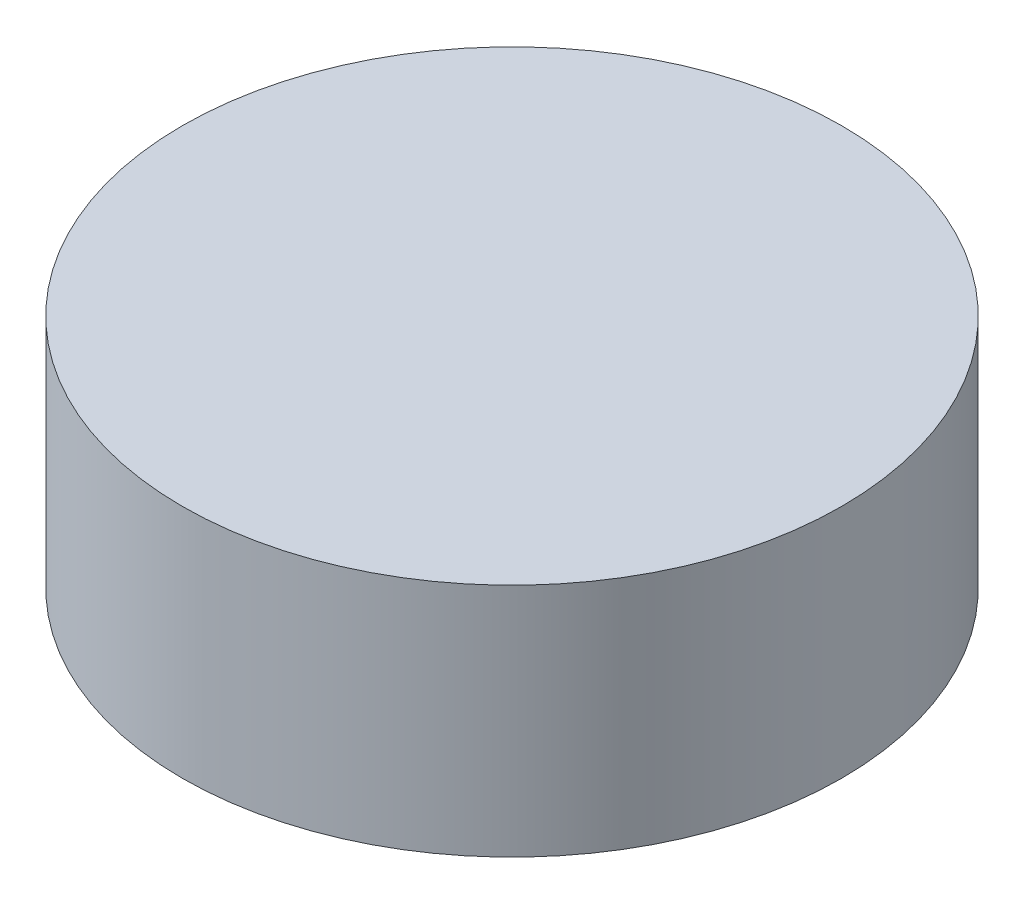
ISO-10303-21;
HEADER;
FILE_DESCRIPTION(('STEP AP214'),'2;1');
FILE_NAME('part.step','',(''),(''),'','','');
FILE_SCHEMA(('AUTOMOTIVE_DESIGN { 1 0 10303 214 1 1 1 1 }'));
ENDSEC;
DATA;
#1=APPLICATION_CONTEXT('core data for automotive mechanical design processes');
#2=APPLICATION_PROTOCOL_DEFINITION('international standard','automotive_design',2000,#1);
#3=PRODUCT_CONTEXT('',#1,'mechanical');
#4=PRODUCT('Part','Part','',(#3));
#5=PRODUCT_RELATED_PRODUCT_CATEGORY('part','',(#4));
#6=PRODUCT_DEFINITION_FORMATION('','',#4);
#7=PRODUCT_DEFINITION_CONTEXT('part definition',#1,'design');
#8=PRODUCT_DEFINITION('design','',#6,#7);
#9=PRODUCT_DEFINITION_SHAPE('','',#8);
#10=(LENGTH_UNIT() NAMED_UNIT(*) SI_UNIT(.MILLI.,.METRE.));
#11=(NAMED_UNIT(*) PLANE_ANGLE_UNIT() SI_UNIT($,.RADIAN.));
#12=(NAMED_UNIT(*) SI_UNIT($,.STERADIAN.) SOLID_ANGLE_UNIT());
#13=UNCERTAINTY_MEASURE_WITH_UNIT(LENGTH_MEASURE(1.E-05),#10,'distance_accuracy_value','');
#14=(GEOMETRIC_REPRESENTATION_CONTEXT(3) GLOBAL_UNCERTAINTY_ASSIGNED_CONTEXT((#13)) GLOBAL_UNIT_ASSIGNED_CONTEXT((#10,
#11,#12)) REPRESENTATION_CONTEXT('',''));
#15=CARTESIAN_POINT('',(0.,0.,0.));
#16=DIRECTION('',(0.,0.,1.));
#17=DIRECTION('',(1.,0.,0.));
#18=AXIS2_PLACEMENT_3D('',#15,#16,#17);
#19=CARTESIAN_POINT('',(0.,16.5007884142857,0.));
#20=DIRECTION('',(0.,-1.,0.));
#21=DIRECTION('',(0.,0.,-1.));
#22=AXIS2_PLACEMENT_3D('',#19,#20,#21);
#23=CYLINDRICAL_SURFACE('',#22,18.20220756);
#24=CARTESIAN_POINT('',(0.,16.5007884142857,0.));
#25=DIRECTION('',(0.,1.,0.));
#26=DIRECTION('',(0.,0.,1.));
#27=AXIS2_PLACEMENT_3D('',#24,#25,#26);
#28=CIRCLE('',#27,18.20220756);
#29=CARTESIAN_POINT('',(0.,16.5007884142857,18.20220756));
#30=VERTEX_POINT('',#29);
#31=EDGE_CURVE('E10',#30,#30,#28,.T.);
#32=ORIENTED_EDGE('',*,*,#31,.F.);
#33=EDGE_LOOP('',(#32));
#34=FACE_BOUND('',#33,.T.);
#35=CARTESIAN_POINT('',(0.,3.49921158571429,0.));
#36=DIRECTION('',(0.,1.,0.));
#37=DIRECTION('',(0.,0.,1.));
#38=AXIS2_PLACEMENT_3D('',#35,#36,#37);
#39=CIRCLE('',#38,18.20220756);
#40=CARTESIAN_POINT('',(0.,3.49921158571429,18.20220756));
#41=VERTEX_POINT('',#40);
#42=EDGE_CURVE('E40',#41,#41,#39,.T.);
#43=ORIENTED_EDGE('',*,*,#42,.T.);
#44=EDGE_LOOP('',(#43));
#45=FACE_BOUND('',#44,.T.);
#46=ADVANCED_FACE('F37',(#34,#45),#23,.T.);
#47=CARTESIAN_POINT('',(0.,16.5007884142857,0.));
#48=DIRECTION('',(0.,1.,0.));
#49=DIRECTION('',(0.,0.,1.));
#50=AXIS2_PLACEMENT_3D('',#47,#48,#49);
#51=PLANE('',#50);
#52=ORIENTED_EDGE('',*,*,#31,.T.);
#53=EDGE_LOOP('',(#52));
#54=FACE_BOUND('',#53,.T.);
#55=ADVANCED_FACE('F52',(#54),#51,.T.);
#56=CARTESIAN_POINT('',(0.,3.49921158571429,0.));
#57=DIRECTION('',(0.,1.,0.));
#58=DIRECTION('',(0.,0.,1.));
#59=AXIS2_PLACEMENT_3D('',#56,#57,#58);
#60=PLANE('',#59);
#61=ORIENTED_EDGE('',*,*,#42,.F.);
#62=EDGE_LOOP('',(#61));
#63=FACE_BOUND('',#62,.T.);
#64=ADVANCED_FACE('F50',(#63),#60,.F.);
#65=CLOSED_SHELL('',(#46,#55,#64));
#66=MANIFOLD_SOLID_BREP('B2',#65);
#67=ADVANCED_BREP_SHAPE_REPRESENTATION('',(#18,#66),#14);
#68=SHAPE_DEFINITION_REPRESENTATION(#9,#67);
ENDSEC;
END-ISO-10303-21;
